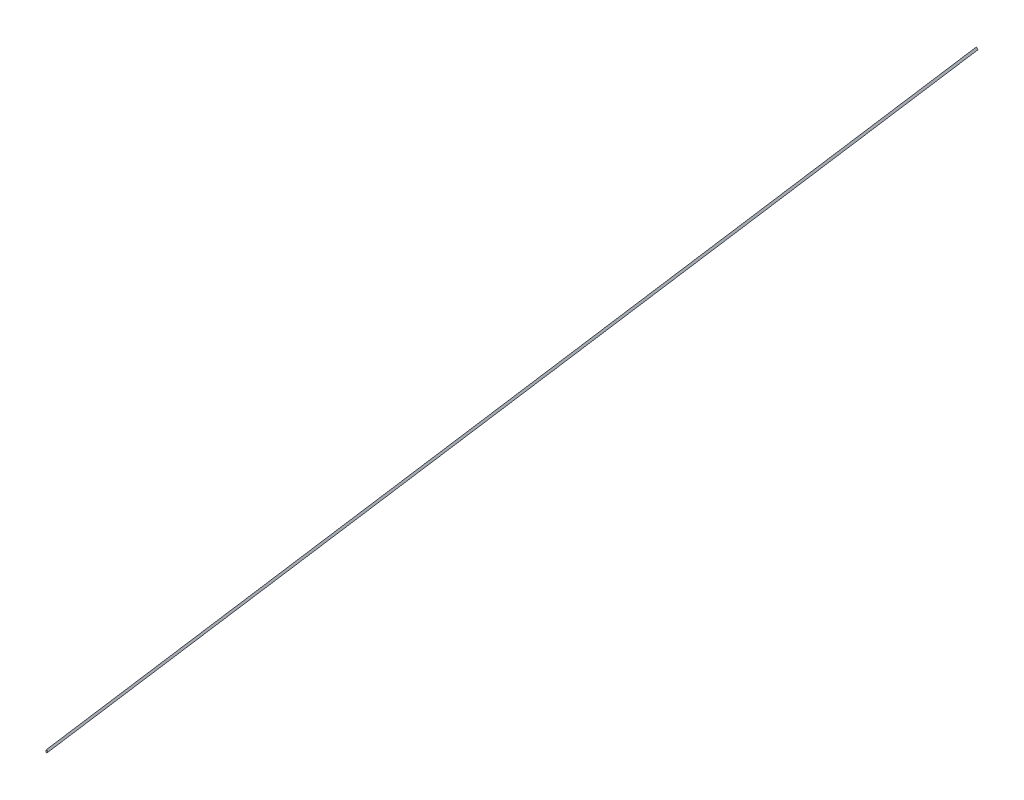
ISO-10303-21;
HEADER;
FILE_DESCRIPTION(('STEP AP214'),'2;1');
FILE_NAME('part.step','',(''),(''),'','','');
FILE_SCHEMA(('AUTOMOTIVE_DESIGN { 1 0 10303 214 1 1 1 1 }'));
ENDSEC;
DATA;
#1=APPLICATION_CONTEXT('core data for automotive mechanical design processes');
#2=APPLICATION_PROTOCOL_DEFINITION('international standard','automotive_design',2000,#1);
#3=PRODUCT_CONTEXT('',#1,'mechanical');
#4=PRODUCT('Part','Part','',(#3));
#5=PRODUCT_RELATED_PRODUCT_CATEGORY('part','',(#4));
#6=PRODUCT_DEFINITION_FORMATION('','',#4);
#7=PRODUCT_DEFINITION_CONTEXT('part definition',#1,'design');
#8=PRODUCT_DEFINITION('design','',#6,#7);
#9=PRODUCT_DEFINITION_SHAPE('','',#8);
#10=(LENGTH_UNIT() NAMED_UNIT(*) SI_UNIT(.MILLI.,.METRE.));
#11=(NAMED_UNIT(*) PLANE_ANGLE_UNIT() SI_UNIT($,.RADIAN.));
#12=(NAMED_UNIT(*) SI_UNIT($,.STERADIAN.) SOLID_ANGLE_UNIT());
#13=UNCERTAINTY_MEASURE_WITH_UNIT(LENGTH_MEASURE(1.E-05),#10,'distance_accuracy_value','');
#14=(GEOMETRIC_REPRESENTATION_CONTEXT(3) GLOBAL_UNCERTAINTY_ASSIGNED_CONTEXT((#13)) GLOBAL_UNIT_ASSIGNED_CONTEXT((#10,
#11,#12)) REPRESENTATION_CONTEXT('',''));
#15=CARTESIAN_POINT('',(0.,0.,0.));
#16=DIRECTION('',(0.,0.,1.));
#17=DIRECTION('',(1.,0.,0.));
#18=AXIS2_PLACEMENT_3D('',#15,#16,#17);
#19=CARTESIAN_POINT('',(186.802064901665,-0.100675386509625,519.));
#20=CARTESIAN_POINT('',(186.5,-0.11177,0.));
#21=CARTESIAN_POINT('',(184.301740117585,-0.192510409138579,519.));
#22=CARTESIAN_POINT('',(182.53151298792,-0.257529501676572,0.));
#23=CARTESIAN_POINT('',(179.301072240108,-0.376143444632647,519.));
#24=CARTESIAN_POINT('',(174.594503856324,-0.548989357900017,0.));
#25=CARTESIAN_POINT('',(171.800088292102,-0.651624025813091,519.));
#26=CARTESIAN_POINT('',(162.689024650844,-0.986230815817351,0.));
#27=CARTESIAN_POINT('',(165.549261937133,-0.881184244897397,519.));
#28=CARTESIAN_POINT('',(152.767778668737,-1.35058377492838,0.));
#29=CARTESIAN_POINT('',(160.548602838584,-1.06483287090551,519.));
#30=CARTESIAN_POINT('',(144.830788269321,-1.64207297234325,0.));
#31=CARTESIAN_POINT('',(156.798108613746,-1.20256980412283,519.));
#32=CARTESIAN_POINT('',(138.878042196265,-1.86068243756924,0.));
#33=CARTESIAN_POINT('',(153.047613594342,-1.34030743939232,519.));
#34=CARTESIAN_POINT('',(132.925298423687,-2.07930151934531,0.));
#35=CARTESIAN_POINT('',(149.297120243623,-1.47806767244789,519.));
#36=CARTESIAN_POINT('',(126.972554738908,-2.29795353188565,0.));
#37=CARTESIAN_POINT('',(145.546626468958,-1.61583165041204,519.000000000001));
#38=CARTESIAN_POINT('',(121.019811855344,-2.51661009477864,0.));
#39=CARTESIAN_POINT('',(141.796131966217,-1.75356762052203,518.999999999999));
#40=CARTESIAN_POINT('',(115.067066999967,-2.73522195192067,0.));
#41=CARTESIAN_POINT('',(138.045633758524,-1.8912067025621,519.));
#42=CARTESIAN_POINT('',(109.114316750361,-2.95368248147338,0.));
#43=CARTESIAN_POINT('',(134.295135189945,-2.02883378700018,518.999999999999));
#44=CARTESIAN_POINT('',(103.161565658307,-3.17212237211382,0.));
#45=CARTESIAN_POINT('',(130.544639436538,-2.16653880323468,519.000000000001));
#46=CARTESIAN_POINT('',(97.2088191359645,-3.39068553638432,0.));
#47=CARTESIAN_POINT('',(126.79415601755,-2.30457880951668,518.999999999999));
#48=CARTESIAN_POINT('',(91.2560922307617,-3.60978326754915,0.));
#49=CARTESIAN_POINT('',(123.04367951181,-2.44280650204524,519.000000000001));
#50=CARTESIAN_POINT('',(85.3033762986066,-3.82917795547762,0.));
#51=CARTESIAN_POINT('',(119.293190628649,-2.58069858507147,518.999999999999));
#52=CARTESIAN_POINT('',(79.3506405187281,-4.04803497414307,0.));
#53=CARTESIAN_POINT('',(115.542663981789,-2.71756041207499,519.000000000001));
#54=CARTESIAN_POINT('',(73.3978449968089,-4.26526177279992,0.));
#55=CARTESIAN_POINT('',(111.792099133404,-2.85337023846857,518.999999999999));
#56=CARTESIAN_POINT('',(67.4449888186704,-4.48081854067511,0.));
#57=CARTESIAN_POINT('',(108.041576692501,-2.99034981164939,519.000000000001));
#58=CARTESIAN_POINT('',(61.4922000664194,-4.69823450098391,0.));
#59=CARTESIAN_POINT('',(104.916240295201,-3.10718781737445,518.999999999999));
#60=CARTESIAN_POINT('',(56.5316998345521,-4.88368190800431,0.));
#61=CARTESIAN_POINT('',(102.416059258898,-3.20297729290566,519.000000000001));
#62=CARTESIAN_POINT('',(52.5634391978605,-5.03571228957255,0.));
#63=CARTESIAN_POINT('',(100.540884166601,-3.27378942976373,518.999999999999));
#64=CARTESIAN_POINT('',(49.5871813378727,-5.14810293094317,0.));
#65=CARTESIAN_POINT('',(98.6656108674653,-3.3419653106147,519.000000000001));
#66=CARTESIAN_POINT('',(46.6107678740035,-5.25631220502355,0.));
#67=CARTESIAN_POINT('',(96.7901760209638,-3.40558730248682,518.999999999999));
#68=CARTESIAN_POINT('',(43.6340974638197,-5.3572893525467,0.));
#69=CARTESIAN_POINT('',(94.9145376313825,-3.46291901247415,519.000000000001));
#70=CARTESIAN_POINT('',(40.657104862593,-5.44828777412586,0.));
#71=CARTESIAN_POINT('',(93.038665939881,-3.51215358959958,518.999999999999));
#72=CARTESIAN_POINT('',(37.6797406382333,-5.52642852700462,0.));
#73=CARTESIAN_POINT('',(91.1625597569897,-3.55145985718924,519.000000000001));
#74=CARTESIAN_POINT('',(34.7020064745827,-5.58882176611169,0.));
#75=CARTESIAN_POINT('',(89.2862279836366,-3.57850640902768,519.));
#76=CARTESIAN_POINT('',(31.7239103324324,-5.63173511470213,0.));
#77=CARTESIAN_POINT('',(87.409741864013,-3.5904998636462,519.));
#78=CARTESIAN_POINT('',(28.7455763805329,-5.65079740180175,0.));
#79=CARTESIAN_POINT('',(85.5332077088808,-3.58548939833163,519.));
#80=CARTESIAN_POINT('',(25.7671528977219,-5.64279356511219,0.));
#81=CARTESIAN_POINT('',(83.6568497219253,-3.55964975904292,519.));
#82=CARTESIAN_POINT('',(22.7890338216423,-5.60187601806448,0.));
#83=CARTESIAN_POINT('',(81.7808786673004,-3.5130585014027,518.999999999999));
#84=CARTESIAN_POINT('',(19.8114826383477,-5.52774021029471,0.));
#85=CARTESIAN_POINT('',(79.9058234901467,-3.43716828258325,519.000000000001));
#86=CARTESIAN_POINT('',(16.8354711329934,-5.40769680488722,0.));
#87=CARTESIAN_POINT('',(78.3441072462963,-3.35848244867081,519.));
#88=CARTESIAN_POINT('',(14.3566626418469,-5.28138624741325,0.));
#89=CARTESIAN_POINT('',(77.0953844812278,-3.2807056217589,519.));
#90=CARTESIAN_POINT('',(12.3747641743416,-5.16002593665186,0.));
#91=CARTESIAN_POINT('',(76.160202158715,-3.20513228627803,519.));
#92=CARTESIAN_POINT('',(10.8904521706146,-5.03799108853755,0.));
#93=CARTESIAN_POINT('',(75.2274142237736,-3.10249160009424,519.));
#94=CARTESIAN_POINT('',(9.40978440042407,-4.87751220635519,0.));
#95=CARTESIAN_POINT('',(74.4532837150413,-2.99154697838824,519.));
#96=CARTESIAN_POINT('',(8.18147453470778,-4.69868922644025,0.));
#97=CARTESIAN_POINT('',(73.8372821062703,-2.8831255687215,519.));
#98=CARTESIAN_POINT('',(7.20323395712825,-4.52931245745169,0.));
#99=CARTESIAN_POINT('',(73.3763082790299,-2.79586453624127,519.));
#100=CARTESIAN_POINT('',(6.47160946854494,-4.39073325062386,0.));
#101=CARTESIAN_POINT('',(72.915737811358,-2.70654640945164,519.));
#102=CARTESIAN_POINT('',(5.74141475253422,-4.2450575245412,0.));
#103=CARTESIAN_POINT('',(72.3029059406366,-2.58112977877818,519.));
#104=CARTESIAN_POINT('',(4.76768811347214,-4.05164297404024,0.));
#105=CARTESIAN_POINT('',(71.5405905264677,-2.40577999513244,519.000000000001));
#106=CARTESIAN_POINT('',(3.55842294034228,-3.76841814399723,0.));
#107=CARTESIAN_POINT('',(70.8119676778371,-2.10792941007383,519.));
#108=CARTESIAN_POINT('',(2.40186473926827,-3.2984816700545,0.));
#109=CARTESIAN_POINT('',(70.2901823562888,-1.76022395892359,519.));
#110=CARTESIAN_POINT('',(1.57347980977523,-2.74552357927177,0.));
#111=CARTESIAN_POINT('',(69.9322848060866,-1.45563144790039,519.));
#112=CARTESIAN_POINT('',(1.00583730005579,-2.26221820231581,0.));
#113=CARTESIAN_POINT('',(69.6209928808814,-1.10268141185139,518.999999999999));
#114=CARTESIAN_POINT('',(0.51082840001471,-1.70278747624527,0.));
#115=CARTESIAN_POINT('',(69.4182806796947,-0.765811531804186,519.));
#116=CARTESIAN_POINT('',(0.190864812022949,-1.16640121149693,0.));
#117=CARTESIAN_POINT('',(69.3195122235756,-0.46691093406255,519.));
#118=CARTESIAN_POINT('',(0.0311253443158539,-0.694219177651205,0.));
#119=CARTESIAN_POINT('',(69.2846368052604,-0.234276118684475,519.));
#120=CARTESIAN_POINT('',(-0.0196762472607387,-0.323590964991827,0.));
#121=CARTESIAN_POINT('',(69.2964625820786,0.000575083985347309,519.));
#122=CARTESIAN_POINT('',(-0.00586108749585029,0.0497314369156607,0.));
#123=CARTESIAN_POINT('',(69.3642763023404,0.307974794839633,519.000000000001));
#124=CARTESIAN_POINT('',(0.105851916702266,0.535756685004302,0.));
#125=CARTESIAN_POINT('',(69.5274630317256,0.665176367532593,519.));
#126=CARTESIAN_POINT('',(0.361870478347706,1.1044539142411,0.));
#127=CARTESIAN_POINT('',(69.7870188963323,1.05705953616754,519.));
#128=CARTESIAN_POINT('',(0.775569706156999,1.72537269203636,0.));
#129=CARTESIAN_POINT('',(70.0850236431449,1.41987487798281,519.));
#130=CARTESIAN_POINT('',(1.24771265738761,2.30176696607214,0.));
#131=CARTESIAN_POINT('',(70.4046355829996,1.76341825838555,518.999999999999));
#132=CARTESIAN_POINT('',(1.75542493778853,2.84677028488833,0.));
#133=CARTESIAN_POINT('',(70.7354697947136,2.09607309107059,519.000000000001));
#134=CARTESIAN_POINT('',(2.28031660971245,3.37488409530116,0.));
#135=CARTESIAN_POINT('',(71.0703055353229,2.4246630454258,518.999999999999));
#136=CARTESIAN_POINT('',(2.81185180112898,3.89636969195818,0.));
#137=CARTESIAN_POINT('',(71.4126480005322,2.74548767898256,519.000000000001));
#138=CARTESIAN_POINT('',(3.35518193565325,4.40558982567713,0.));
#139=CARTESIAN_POINT('',(71.7654339071712,3.05485231926029,518.999999999999));
#140=CARTESIAN_POINT('',(3.91512565220644,4.8966189743816,0.));
#141=CARTESIAN_POINT('',(72.1302900995024,3.34987392654191,519.000000000001));
#142=CARTESIAN_POINT('',(4.49422431810771,5.36486034141795,0.));
#143=CARTESIAN_POINT('',(72.6308634247749,3.72515334058811,518.999999999999));
#144=CARTESIAN_POINT('',(5.28872386006556,5.96051570277589,0.));
#145=CARTESIAN_POINT('',(73.2822399015257,4.15852285642544,519.));
#146=CARTESIAN_POINT('',(6.3225810318319,6.64835006754605,0.));
#147=CARTESIAN_POINT('',(74.0946092419458,4.62864442571416,519.000000000001));
#148=CARTESIAN_POINT('',(7.61196309147069,7.39452813032449,0.));
#149=CARTESIAN_POINT('',(74.9279589470546,5.06020903963744,519.));
#150=CARTESIAN_POINT('',(8.93464571141178,8.07950371220677,0.));
#151=CARTESIAN_POINT('',(75.7783590794079,5.45704542115885,519.000000000001));
#152=CARTESIAN_POINT('',(10.284391030357,8.70935979985582,0.));
#153=CARTESIAN_POINT('',(76.6414680286125,5.82520676973568,518.999999999999));
#154=CARTESIAN_POINT('',(11.6543074041472,9.29370410949651,0.));
#155=CARTESIAN_POINT('',(77.5141207691668,6.17009462478968,519.));
#156=CARTESIAN_POINT('',(13.0393725121408,9.84110469365126,0.));
#157=CARTESIAN_POINT('',(78.3943674269924,6.49501002295762,519.));
#158=CARTESIAN_POINT('',(14.4364892051698,10.3568136649554,0.));
#159=CARTESIAN_POINT('',(79.2800921307167,6.80464963745708,519.));
#160=CARTESIAN_POINT('',(15.8423035573358,10.848259863891,0.));
#161=CARTESIAN_POINT('',(80.1706874884467,7.09997632518966,519.));
#162=CARTESIAN_POINT('',(17.2558428445566,11.3170228262168,0.));
#163=CARTESIAN_POINT('',(81.0661551022846,7.3802223835755,519.));
#164=CARTESIAN_POINT('',(18.677125158932,11.7617918938286,0.));
#165=CARTESIAN_POINT('',(81.9662508152407,7.64517735256458,519.));
#166=CARTESIAN_POINT('',(20.1057405616819,12.1823630123569,0.));
#167=CARTESIAN_POINT('',(83.1719072713148,7.97913494696539,519.));
#168=CARTESIAN_POINT('',(22.0193521287151,12.7123865346097,0.));
#169=CARTESIAN_POINT('',(84.6881407391087,8.36237579751592,519.000000000001));
#170=CARTESIAN_POINT('',(24.4258925728851,13.3206790852296,0.));
#171=CARTESIAN_POINT('',(86.5191116425936,8.77393209885549,518.999999999999));
#172=CARTESIAN_POINT('',(27.3319908337744,13.9739287373055,0.));
#173=CARTESIAN_POINT('',(88.3594288690151,9.14140941317154,519.000000000001));
#174=CARTESIAN_POINT('',(30.2529321337696,14.557074638031,0.));
#175=CARTESIAN_POINT('',(90.2080291006012,9.46463506703223,519.));
#176=CARTESIAN_POINT('',(33.1869862385385,15.0703296729119,0.));
#177=CARTESIAN_POINT('',(92.0640523386663,9.74222880420643,519.));
#178=CARTESIAN_POINT('',(36.1328928461894,15.5104879956208,0.));
#179=CARTESIAN_POINT('',(93.9266280813164,9.97179066584406,519.));
#180=CARTESIAN_POINT('',(39.0890758637837,15.8755604444459,0.));
#181=CARTESIAN_POINT('',(95.7939159369522,10.1583801684968,519.));
#182=CARTESIAN_POINT('',(42.0529144334272,16.1708309628102,0.));
#183=CARTESIAN_POINT('',(98.2882077886442,10.3571757102286,518.999999999999));
#184=CARTESIAN_POINT('',(46.0117213359558,16.4870725242194,0.));
#185=CARTESIAN_POINT('',(101.411447486462,10.5256368030861,519.000000000001));
#186=CARTESIAN_POINT('',(50.9689623977678,16.7541688613502,0.));
#187=CARTESIAN_POINT('',(105.162522333063,10.6499152365233,518.999999999999));
#188=CARTESIAN_POINT('',(56.9225854931495,16.9515307073642,0.));
#189=CARTESIAN_POINT('',(108.914787161886,10.7286428942635,519.000000000001));
#190=CARTESIAN_POINT('',(62.878167059554,17.0763439398652,0.));
#191=CARTESIAN_POINT('',(112.667939144647,10.7454891679668,518.999999999999));
#192=CARTESIAN_POINT('',(68.8351144762445,17.1031705173644,0.));
#193=CARTESIAN_POINT('',(116.420770467995,10.692913200216,519.000000000001));
#194=CARTESIAN_POINT('',(74.7915759799195,17.0196743995973,0.));
#195=CARTESIAN_POINT('',(120.171702143721,10.5615575011206,518.999999999999));
#196=CARTESIAN_POINT('',(80.7450104761488,16.8112163894735,0.));
#197=CARTESIAN_POINT('',(123.919518758997,10.3615353255813,519.));
#198=CARTESIAN_POINT('',(86.6935062774885,16.4937267510464,0.));
#199=CARTESIAN_POINT('',(127.663513688025,10.0996772562087,519.));
#200=CARTESIAN_POINT('',(92.6359350902858,16.078122539833,0.));
#201=CARTESIAN_POINT('',(131.403356338123,9.78436237576417,519.));
#202=CARTESIAN_POINT('',(98.5717709598855,15.5776430192207,0.));
#203=CARTESIAN_POINT('',(135.138327593319,9.41572798250734,519.));
#204=CARTESIAN_POINT('',(104.499882257419,14.992574630128,0.));
#205=CARTESIAN_POINT('',(138.867757224693,8.99469781464294,519.));
#206=CARTESIAN_POINT('',(110.419182996881,14.324278725264,0.));
#207=CARTESIAN_POINT('',(142.590867676924,8.52115735485082,519.));
#208=CARTESIAN_POINT('',(116.328482783678,13.5727576636436,0.));
#209=CARTESIAN_POINT('',(146.307668007778,8.00042382423986,518.999999999999));
#210=CARTESIAN_POINT('',(122.22771209017,12.7461060378356,0.));
#211=CARTESIAN_POINT('',(150.018269038257,7.43750358717203,519.000000000001));
#212=CARTESIAN_POINT('',(128.117209234075,11.8529453870467,0.));
#213=CARTESIAN_POINT('',(153.723370970154,6.83926062043783,519.));
#214=CARTESIAN_POINT('',(133.997778866043,10.9028846596537,0.));
#215=CARTESIAN_POINT('',(157.422696781995,6.20664729050174,519.));
#216=CARTESIAN_POINT('',(139.869499775633,9.89959500056334,0.));
#217=CARTESIAN_POINT('',(161.116362652529,5.5414619469668,519.));
#218=CARTESIAN_POINT('',(145.731896750819,8.84320344169156,0.));
#219=CARTESIAN_POINT('',(166.03322719479,4.61111894343827,519.));
#220=CARTESIAN_POINT('',(153.535721304373,7.36589874472885,0.));
#221=CARTESIAN_POINT('',(170.937341764311,3.61563233066163,519.));
#222=CARTESIAN_POINT('',(161.32013042915,5.78854065201773,0.));
#223=CARTESIAN_POINT('',(175.830483068152,2.56760701646496,519.));
#224=CARTESIAN_POINT('',(169.085620297792,4.12162508901313,0.));
#225=CARTESIAN_POINT('',(179.493928807153,1.75239650534458,519.));
#226=CARTESIAN_POINT('',(174.900524341098,2.82912948503774,0.));
#227=CARTESIAN_POINT('',(183.150040701236,0.905072293988474,519.));
#228=CARTESIAN_POINT('',(180.704029066626,1.48645900579351,0.));
#229=CARTESIAN_POINT('',(185.58479942704,0.328720348079635,519.));
#230=CARTESIAN_POINT('',(184.567970106492,0.56976201866848,0.));
#231=CARTESIAN_POINT('',(186.84509768735,0.0299638193615717,519.));
#232=CARTESIAN_POINT('',(186.568301147184,0.0955790599004437,0.));
#233=CARTESIAN_POINT('',(186.930671321919,0.00967839739544089,519.));
#234=CARTESIAN_POINT('',(186.70412264567,0.0633822691162288,0.));
#235=CARTESIAN_POINT('',(187.059277742173,-0.0208080429147428,519.000000000001));
#236=CARTESIAN_POINT('',(186.908245291341,0.0149945382324509,0.));
#237=CARTESIAN_POINT('',(187.187884162427,-0.0512944832249222,519.));
#238=CARTESIAN_POINT('',(187.112367937011,-0.0333931926513245,0.));
#239=CARTESIAN_POINT('',(187.27362177593,-0.0716187767650499,519.));
#240=CARTESIAN_POINT('',(187.248449700791,-0.0656516799071842,0.));
#241=CARTESIAN_POINT('',(187.316490582681,-0.0817809235351109,519.));
#242=CARTESIAN_POINT('',(187.316490582681,-0.0817809235351109,0.));
#243=B_SPLINE_SURFACE_WITH_KNOTS('',3,1,((#19,#20),(#21,#22),(#23,#24),(#25,#26),(#27,#28),(#29,
#30),(#31,#32),(#33,#34),(#35,#36),(#37,#38),(#39,#40),(#41,#42),(#43,#44),(#45,#46),(#47,#48),
(#49,#50),(#51,#52),(#53,#54),(#55,#56),(#57,#58),(#59,#60),(#61,#62),(#63,#64),(#65,#66),(#67,
#68),(#69,#70),(#71,#72),(#73,#74),(#75,#76),(#77,#78),(#79,#80),(#81,#82),(#83,#84),(#85,#86),
(#87,#88),(#89,#90),(#91,#92),(#93,#94),(#95,#96),(#97,#98),(#99,#100),(#101,#102),(#103,#104),
(#105,#106),(#107,#108),(#109,#110),(#111,#112),(#113,#114),(#115,#116),(#117,#118),(#119,#120),
(#121,#122),(#123,#124),(#125,#126),(#127,#128),(#129,#130),(#131,#132),(#133,#134),(#135,#136),
(#137,#138),(#139,#140),(#141,#142),(#143,#144),(#145,#146),(#147,#148),(#149,#150),(#151,#152),
(#153,#154),(#155,#156),(#157,#158),(#159,#160),(#161,#162),(#163,#164),(#165,#166),(#167,#168),
(#169,#170),(#171,#172),(#173,#174),(#175,#176),(#177,#178),(#179,#180),(#181,#182),(#183,#184),
(#185,#186),(#187,#188),(#189,#190),(#191,#192),(#193,#194),(#195,#196),(#197,#198),(#199,#200),
(#201,#202),(#203,#204),(#205,#206),(#207,#208),(#209,#210),(#211,#212),(#213,#214),(#215,#216),
(#217,#218),(#219,#220),(#221,#222),(#223,#224),(#225,#226),(#227,#228),(#229,#230),(#231,#232),
(#233,#234),(#235,#236),(#237,#238),(#239,#240),(#241,#242)),.UNSPECIFIED.,.F.,.F.,.F.,(4,1,1,1,
1,1,1,1,1,1,1,1,1,1,1,1,1,1,1,1,1,1,1,1,1,1,1,1,1,1,1,1,1,1,1,1,1,1,1,1,1,1,1,1,1,1,1,1,1,1,1,1,
1,1,1,1,1,1,1,1,1,1,1,1,1,1,1,1,1,1,1,1,1,1,1,1,1,1,1,1,1,1,1,1,1,1,1,1,1,1,1,1,1,1,1,1,1,1,1,1,
1,1,1,1,2,1,1,1,4),(2,2),(0.,0.0311811053211745,0.0623622106423489,0.0935433159635234,
0.109133868624111,0.124724421284698,0.140314973945285,0.155905526605872,0.17149607926646,
0.187086631927047,0.202677184587634,0.218267737248221,0.233858289908809,0.249448842569396,
0.265039395229983,0.28062994789057,0.296220500551158,0.311811053211745,0.327401605872332,
0.342992158532919,0.350787434863213,0.358582711193506,0.3663779875238,0.374173263854094,
0.381968540184387,0.389763816514681,0.397559092844974,0.405354369175268,0.413149645505562,
0.420944921835855,0.428740198166149,0.436535474496443,0.444330750826736,0.45212602715703,
0.456023665322177,0.459921303487323,0.46381894165247,0.467716579817617,0.46966539890019,
0.471614217982764,0.473563037065337,0.475511856147911,0.479409494313058,0.483307132478204,
0.485255951560778,0.487204770643351,0.489153589725925,0.491102408808498,0.492076818349785,
0.493051227891071,0.494025637432358,0.495000046973645,0.496948866056218,0.498897685138791,
0.500846504221365,0.502795323303939,0.504744142386512,0.506692961469085,0.508641780551659,
0.510590599634232,0.512539418716806,0.514488237799379,0.518385875964525,0.522283514129673,
0.526181152294819,0.530078790459966,0.533976428625113,0.53787406679026,0.541771704955407,
0.545669343120553,0.5495669812857,0.553464619450847,0.557362257615994,0.561259895781141,
0.569055172111434,0.576850448441728,0.584645724772021,0.592441001102315,0.600236277432609,
0.608031553762902,0.615826830093196,0.62362210642349,0.639212659084077,0.654803211744664,
0.670393764405251,0.685984317065839,0.701574869726425,0.717165422387013,0.7327559750476,
0.748346527708187,0.763937080368774,0.779527633029362,0.795118185689949,0.810708738350536,
0.826299291011123,0.841889843671711,0.857480396332298,0.873070948992885,0.888661501653472,
0.90425205431406,0.935433159635234,0.951023712295821,0.966614264956409,0.982204817616996,
0.997795370277583,0.998346527708187,0.998897685138791,0.999448842569396,1.),(0.,1.),.UNSPECIFIED.);
#244=CARTESIAN_POINT('',(186.802064901665,-0.100675386509625,519.));
#245=CARTESIAN_POINT('',(184.301740117585,-0.192510409138579,519.));
#246=CARTESIAN_POINT('',(179.301072240108,-0.376143444632647,519.));
#247=CARTESIAN_POINT('',(171.800088292102,-0.651624025813091,519.));
#248=CARTESIAN_POINT('',(165.549261937133,-0.881184244897397,519.));
#249=CARTESIAN_POINT('',(160.548602838584,-1.06483287090551,519.));
#250=CARTESIAN_POINT('',(156.798108613746,-1.20256980412283,519.));
#251=CARTESIAN_POINT('',(153.047613594342,-1.34030743939232,519.));
#252=CARTESIAN_POINT('',(149.297120243623,-1.47806767244789,519.));
#253=CARTESIAN_POINT('',(145.546626468958,-1.61583165041204,519.000000000001));
#254=CARTESIAN_POINT('',(141.796131966217,-1.75356762052203,518.999999999999));
#255=CARTESIAN_POINT('',(138.045633758524,-1.8912067025621,519.));
#256=CARTESIAN_POINT('',(134.295135189945,-2.02883378700018,518.999999999999));
#257=CARTESIAN_POINT('',(130.544639436538,-2.16653880323468,519.000000000001));
#258=CARTESIAN_POINT('',(126.79415601755,-2.30457880951668,518.999999999999));
#259=CARTESIAN_POINT('',(123.04367951181,-2.44280650204524,519.000000000001));
#260=CARTESIAN_POINT('',(119.293190628649,-2.58069858507147,518.999999999999));
#261=CARTESIAN_POINT('',(115.542663981789,-2.71756041207499,519.000000000001));
#262=CARTESIAN_POINT('',(111.792099133404,-2.85337023846857,518.999999999999));
#263=CARTESIAN_POINT('',(108.041576692501,-2.99034981164939,519.000000000001));
#264=CARTESIAN_POINT('',(104.916240295201,-3.10718781737445,518.999999999999));
#265=CARTESIAN_POINT('',(102.416059258898,-3.20297729290566,519.000000000001));
#266=CARTESIAN_POINT('',(100.540884166601,-3.27378942976373,518.999999999999));
#267=CARTESIAN_POINT('',(98.6656108674653,-3.3419653106147,519.000000000001));
#268=CARTESIAN_POINT('',(96.7901760209638,-3.40558730248682,518.999999999999));
#269=CARTESIAN_POINT('',(94.9145376313825,-3.46291901247415,519.000000000001));
#270=CARTESIAN_POINT('',(93.038665939881,-3.51215358959958,518.999999999999));
#271=CARTESIAN_POINT('',(91.1625597569897,-3.55145985718924,519.000000000001));
#272=CARTESIAN_POINT('',(89.2862279836366,-3.57850640902768,519.));
#273=CARTESIAN_POINT('',(87.409741864013,-3.5904998636462,519.));
#274=CARTESIAN_POINT('',(85.5332077088808,-3.58548939833163,519.));
#275=CARTESIAN_POINT('',(83.6568497219253,-3.55964975904292,519.));
#276=CARTESIAN_POINT('',(81.7808786673004,-3.5130585014027,518.999999999999));
#277=CARTESIAN_POINT('',(79.9058234901467,-3.43716828258325,519.000000000001));
#278=CARTESIAN_POINT('',(78.3441072462963,-3.35848244867081,519.));
#279=CARTESIAN_POINT('',(77.0953844812278,-3.2807056217589,519.));
#280=CARTESIAN_POINT('',(76.160202158715,-3.20513228627803,519.));
#281=CARTESIAN_POINT('',(75.2274142237736,-3.10249160009424,519.));
#282=CARTESIAN_POINT('',(74.4532837150413,-2.99154697838824,519.));
#283=CARTESIAN_POINT('',(73.8372821062703,-2.8831255687215,519.));
#284=CARTESIAN_POINT('',(73.3763082790299,-2.79586453624127,519.));
#285=CARTESIAN_POINT('',(72.915737811358,-2.70654640945164,519.));
#286=CARTESIAN_POINT('',(72.3029059406366,-2.58112977877818,519.));
#287=CARTESIAN_POINT('',(71.5405905264677,-2.40577999513244,519.000000000001));
#288=CARTESIAN_POINT('',(70.8119676778371,-2.10792941007383,519.));
#289=CARTESIAN_POINT('',(70.2901823562888,-1.76022395892359,519.));
#290=CARTESIAN_POINT('',(69.9322848060866,-1.45563144790039,519.));
#291=CARTESIAN_POINT('',(69.6209928808814,-1.10268141185139,518.999999999999));
#292=CARTESIAN_POINT('',(69.4182806796947,-0.765811531804186,519.));
#293=CARTESIAN_POINT('',(69.3195122235756,-0.46691093406255,519.));
#294=CARTESIAN_POINT('',(69.2846368052604,-0.234276118684475,519.));
#295=CARTESIAN_POINT('',(69.2964625820786,0.000575083985347309,519.));
#296=CARTESIAN_POINT('',(69.3642763023404,0.307974794839633,519.000000000001));
#297=CARTESIAN_POINT('',(69.5274630317256,0.665176367532593,519.));
#298=CARTESIAN_POINT('',(69.7870188963323,1.05705953616754,519.));
#299=CARTESIAN_POINT('',(70.0850236431449,1.41987487798281,519.));
#300=CARTESIAN_POINT('',(70.4046355829996,1.76341825838555,518.999999999999));
#301=CARTESIAN_POINT('',(70.7354697947136,2.09607309107059,519.000000000001));
#302=CARTESIAN_POINT('',(71.0703055353229,2.4246630454258,518.999999999999));
#303=CARTESIAN_POINT('',(71.4126480005322,2.74548767898256,519.000000000001));
#304=CARTESIAN_POINT('',(71.7654339071712,3.05485231926029,518.999999999999));
#305=CARTESIAN_POINT('',(72.1302900995024,3.34987392654191,519.000000000001));
#306=CARTESIAN_POINT('',(72.6308634247749,3.72515334058811,518.999999999999));
#307=CARTESIAN_POINT('',(73.2822399015257,4.15852285642544,519.));
#308=CARTESIAN_POINT('',(74.0946092419458,4.62864442571416,519.000000000001));
#309=CARTESIAN_POINT('',(74.9279589470546,5.06020903963744,519.));
#310=CARTESIAN_POINT('',(75.7783590794079,5.45704542115885,519.000000000001));
#311=CARTESIAN_POINT('',(76.6414680286125,5.82520676973568,518.999999999999));
#312=CARTESIAN_POINT('',(77.5141207691668,6.17009462478968,519.));
#313=CARTESIAN_POINT('',(78.3943674269924,6.49501002295762,519.));
#314=CARTESIAN_POINT('',(79.2800921307167,6.80464963745708,519.));
#315=CARTESIAN_POINT('',(80.1706874884467,7.09997632518966,519.));
#316=CARTESIAN_POINT('',(81.0661551022846,7.3802223835755,519.));
#317=CARTESIAN_POINT('',(81.9662508152407,7.64517735256458,519.));
#318=CARTESIAN_POINT('',(83.1719072713148,7.97913494696539,519.));
#319=CARTESIAN_POINT('',(84.6881407391087,8.36237579751592,519.000000000001));
#320=CARTESIAN_POINT('',(86.5191116425936,8.77393209885549,518.999999999999));
#321=CARTESIAN_POINT('',(88.3594288690151,9.14140941317154,519.000000000001));
#322=CARTESIAN_POINT('',(90.2080291006012,9.46463506703223,519.));
#323=CARTESIAN_POINT('',(92.0640523386663,9.74222880420643,519.));
#324=CARTESIAN_POINT('',(93.9266280813164,9.97179066584406,519.));
#325=CARTESIAN_POINT('',(95.7939159369522,10.1583801684968,519.));
#326=CARTESIAN_POINT('',(98.2882077886442,10.3571757102286,518.999999999999));
#327=CARTESIAN_POINT('',(101.411447486462,10.5256368030861,519.000000000001));
#328=CARTESIAN_POINT('',(105.162522333063,10.6499152365233,518.999999999999));
#329=CARTESIAN_POINT('',(108.914787161886,10.7286428942635,519.000000000001));
#330=CARTESIAN_POINT('',(112.667939144647,10.7454891679668,518.999999999999));
#331=CARTESIAN_POINT('',(116.420770467995,10.692913200216,519.000000000001));
#332=CARTESIAN_POINT('',(120.171702143721,10.5615575011206,518.999999999999));
#333=CARTESIAN_POINT('',(123.919518758997,10.3615353255813,519.));
#334=CARTESIAN_POINT('',(127.663513688025,10.0996772562087,519.));
#335=CARTESIAN_POINT('',(131.403356338123,9.78436237576417,519.));
#336=CARTESIAN_POINT('',(135.138327593319,9.41572798250734,519.));
#337=CARTESIAN_POINT('',(138.867757224693,8.99469781464294,519.));
#338=CARTESIAN_POINT('',(142.590867676924,8.52115735485082,519.));
#339=CARTESIAN_POINT('',(146.307668007778,8.00042382423986,518.999999999999));
#340=CARTESIAN_POINT('',(150.018269038257,7.43750358717203,519.000000000001));
#341=CARTESIAN_POINT('',(153.723370970154,6.83926062043783,519.));
#342=CARTESIAN_POINT('',(157.422696781995,6.20664729050174,519.));
#343=CARTESIAN_POINT('',(161.116362652529,5.5414619469668,519.));
#344=CARTESIAN_POINT('',(166.03322719479,4.61111894343827,519.));
#345=CARTESIAN_POINT('',(170.937341764311,3.61563233066163,519.));
#346=CARTESIAN_POINT('',(175.830483068152,2.56760701646496,519.));
#347=CARTESIAN_POINT('',(179.493928807153,1.75239650534458,519.));
#348=CARTESIAN_POINT('',(183.150040701236,0.905072293988474,519.));
#349=CARTESIAN_POINT('',(185.58479942704,0.328720348079635,519.));
#350=CARTESIAN_POINT('',(186.84509768735,0.0299638193615717,519.));
#351=CARTESIAN_POINT('',(186.930671321919,0.00967839739544089,519.));
#352=CARTESIAN_POINT('',(187.059277742173,-0.0208080429147428,519.000000000001));
#353=CARTESIAN_POINT('',(187.187884162427,-0.0512944832249222,519.));
#354=CARTESIAN_POINT('',(187.27362177593,-0.0716187767650499,519.));
#355=CARTESIAN_POINT('',(187.316490582681,-0.0817809235351109,519.));
#356=B_SPLINE_CURVE_WITH_KNOTS('',3,(#244,#245,#246,#247,#248,#249,#250,#251,#252,#253,#254,
#255,#256,#257,#258,#259,#260,#261,#262,#263,#264,#265,#266,#267,#268,#269,#270,#271,#272,#273,
#274,#275,#276,#277,#278,#279,#280,#281,#282,#283,#284,#285,#286,#287,#288,#289,#290,#291,#292,
#293,#294,#295,#296,#297,#298,#299,#300,#301,#302,#303,#304,#305,#306,#307,#308,#309,#310,#311,
#312,#313,#314,#315,#316,#317,#318,#319,#320,#321,#322,#323,#324,#325,#326,#327,#328,#329,#330,
#331,#332,#333,#334,#335,#336,#337,#338,#339,#340,#341,#342,#343,#344,#345,#346,#347,#348,#349,
#350,#351,#352,#353,#354,#355),.UNSPECIFIED.,.F.,.F.,(4,1,1,1,1,1,1,1,1,1,1,1,1,1,1,1,1,1,1,1,1,
1,1,1,1,1,1,1,1,1,1,1,1,1,1,1,1,1,1,1,1,1,1,1,1,1,1,1,1,1,1,1,1,1,1,1,1,1,1,1,1,1,1,1,1,1,1,1,1,
1,1,1,1,1,1,1,1,1,1,1,1,1,1,1,1,1,1,1,1,1,1,1,1,1,1,1,1,1,1,1,1,1,1,1,2,1,1,1,4),(0.,
0.0311811053211745,0.0623622106423489,0.0935433159635234,0.109133868624111,0.124724421284698,
0.140314973945285,0.155905526605872,0.17149607926646,0.187086631927047,0.202677184587634,
0.218267737248221,0.233858289908809,0.249448842569396,0.265039395229983,0.28062994789057,
0.296220500551158,0.311811053211745,0.327401605872332,0.342992158532919,0.350787434863213,
0.358582711193506,0.3663779875238,0.374173263854094,0.381968540184387,0.389763816514681,
0.397559092844974,0.405354369175268,0.413149645505562,0.420944921835855,0.428740198166149,
0.436535474496443,0.444330750826736,0.45212602715703,0.456023665322177,0.459921303487323,
0.46381894165247,0.467716579817617,0.46966539890019,0.471614217982764,0.473563037065337,
0.475511856147911,0.479409494313058,0.483307132478204,0.485255951560778,0.487204770643351,
0.489153589725925,0.491102408808498,0.492076818349785,0.493051227891071,0.494025637432358,
0.495000046973645,0.496948866056218,0.498897685138791,0.500846504221365,0.502795323303939,
0.504744142386512,0.506692961469085,0.508641780551659,0.510590599634232,0.512539418716806,
0.514488237799379,0.518385875964525,0.522283514129673,0.526181152294819,0.530078790459966,
0.533976428625113,0.53787406679026,0.541771704955407,0.545669343120553,0.5495669812857,
0.553464619450847,0.557362257615994,0.561259895781141,0.569055172111434,0.576850448441728,
0.584645724772021,0.592441001102315,0.600236277432609,0.608031553762902,0.615826830093196,
0.62362210642349,0.639212659084077,0.654803211744664,0.670393764405251,0.685984317065839,
0.701574869726425,0.717165422387013,0.7327559750476,0.748346527708187,0.763937080368774,
0.779527633029362,0.795118185689949,0.810708738350536,0.826299291011123,0.841889843671711,
0.857480396332298,0.873070948992885,0.888661501653472,0.90425205431406,0.935433159635234,
0.951023712295821,0.966614264956409,0.982204817616996,0.997795370277583,0.998346527708187,
0.998897685138791,0.999448842569396,1.),.UNSPECIFIED.);
#357=CARTESIAN_POINT('',(69.4670751072604,-0.832923282789486,519.));
#358=VERTEX_POINT('',#357);
#359=CARTESIAN_POINT('',(69.5754874767769,0.724512523223147,519.));
#360=VERTEX_POINT('',#359);
#361=EDGE_CURVE('E85',#358,#360,#356,.T.);
#362=CARTESIAN_POINT('',(69.5754839111667,0.724516088000441,518.999999999945));
#363=CARTESIAN_POINT('',(69.4624716298262,0.724633940232413,518.154513580061));
#364=CARTESIAN_POINT('',(69.3494595447832,0.724751592560027,517.309027133911));
#365=CARTESIAN_POINT('',(68.7844000960259,0.725338859908244,513.0815947725));
#366=CARTESIAN_POINT('',(68.3323556616841,0.72580549205928,509.699648465271));
#367=CARTESIAN_POINT('',(66.7271122655217,0.727451487925129,497.690022920928));
#368=CARTESIAN_POINT('',(65.5739301599798,0.728613695227727,489.062341428392));
#369=CARTESIAN_POINT('',(62.114440469441,0.732042678754324,463.179289374367));
#370=CARTESIAN_POINT('',(59.8081895105607,0.734251816597096,445.923911236684));
#371=CARTESIAN_POINT('',(52.8896412678518,0.740670941162551,394.157749446808));
#372=CARTESIAN_POINT('',(48.2775486181351,0.744672638922183,359.646938419134));
#373=CARTESIAN_POINT('',(41.35975877433,0.750319819776572,307.88067518505));
#374=CARTESIAN_POINT('',(39.05388701491,0.75214298576382,290.625246325325));
#375=CARTESIAN_POINT('',(34.4422501706463,0.755680738317253,256.114374339924));
#376=CARTESIAN_POINT('',(32.1364850858026,0.757395324883438,238.858931214247));
#377=CARTESIAN_POINT('',(27.5250525760521,0.760725094347994,204.348031903843));
#378=CARTESIAN_POINT('',(25.2193851511452,0.762340277246365,187.092575719116));
#379=CARTESIAN_POINT('',(19.1459071736687,0.766475349476128,141.63818945906));
#380=CARTESIAN_POINT('',(15.3781711705977,0.768919358322189,113.439249415726));
#381=CARTESIAN_POINT('',(7.84290178015176,0.77359767755275,57.0413162849671));
#382=CARTESIAN_POINT('',(4.07536839296307,0.775831987747617,28.8423231975182));
#383=CARTESIAN_POINT('',(0.279274808287956,0.777991664527794,0.428878779095908));
#384=CARTESIAN_POINT('',(0.250625277866575,0.778007958587368,0.214439389892858));
#385=CARTESIAN_POINT('',(0.221975752605466,0.778024247394563,0.));
#386=B_SPLINE_CURVE_WITH_KNOTS('',3,(#362,#363,#364,#365,#366,#367,#368,#369,#370,#371,#372,
#373,#374,#375,#376,#377,#378,#379,#380,#381,#382,#383,#384,#385),.UNSPECIFIED.,.F.,.F.,(4,2,2,
2,2,2,2,2,2,2,2,4),(0.,2.55901771828264,12.7950885914207,38.9083125266873,91.134760397894,
195.587656144378,247.814104015206,300.040551885944,352.266999756604,437.615605725551,
522.96428887535,523.61332310211),.UNSPECIFIED.);
#387=CARTESIAN_POINT('',(0.221974021099499,0.778025978900538,0.));
#388=VERTEX_POINT('',#387);
#389=EDGE_CURVE('E106',#360,#388,#386,.T.);
#390=CARTESIAN_POINT('',(186.5,-0.11177,0.));
#391=CARTESIAN_POINT('',(182.53151298792,-0.257529501676572,0.));
#392=CARTESIAN_POINT('',(174.594503856324,-0.548989357900017,0.));
#393=CARTESIAN_POINT('',(162.689024650844,-0.986230815817351,0.));
#394=CARTESIAN_POINT('',(152.767778668737,-1.35058377492838,0.));
#395=CARTESIAN_POINT('',(144.830788269321,-1.64207297234325,0.));
#396=CARTESIAN_POINT('',(138.878042196265,-1.86068243756924,0.));
#397=CARTESIAN_POINT('',(132.925298423687,-2.07930151934531,0.));
#398=CARTESIAN_POINT('',(126.972554738908,-2.29795353188565,0.));
#399=CARTESIAN_POINT('',(121.019811855344,-2.51661009477864,0.));
#400=CARTESIAN_POINT('',(115.067066999967,-2.73522195192067,0.));
#401=CARTESIAN_POINT('',(109.114316750361,-2.95368248147338,0.));
#402=CARTESIAN_POINT('',(103.161565658307,-3.17212237211382,0.));
#403=CARTESIAN_POINT('',(97.2088191359645,-3.39068553638432,0.));
#404=CARTESIAN_POINT('',(91.2560922307617,-3.60978326754915,0.));
#405=CARTESIAN_POINT('',(85.3033762986066,-3.82917795547762,0.));
#406=CARTESIAN_POINT('',(79.3506405187281,-4.04803497414307,0.));
#407=CARTESIAN_POINT('',(73.3978449968089,-4.26526177279992,0.));
#408=CARTESIAN_POINT('',(67.4449888186704,-4.48081854067511,0.));
#409=CARTESIAN_POINT('',(61.4922000664194,-4.69823450098391,0.));
#410=CARTESIAN_POINT('',(56.5316998345521,-4.88368190800431,0.));
#411=CARTESIAN_POINT('',(52.5634391978605,-5.03571228957255,0.));
#412=CARTESIAN_POINT('',(49.5871813378727,-5.14810293094317,0.));
#413=CARTESIAN_POINT('',(46.6107678740035,-5.25631220502355,0.));
#414=CARTESIAN_POINT('',(43.6340974638197,-5.3572893525467,0.));
#415=CARTESIAN_POINT('',(40.657104862593,-5.44828777412586,0.));
#416=CARTESIAN_POINT('',(37.6797406382333,-5.52642852700462,0.));
#417=CARTESIAN_POINT('',(34.7020064745827,-5.58882176611169,0.));
#418=CARTESIAN_POINT('',(31.7239103324324,-5.63173511470213,0.));
#419=CARTESIAN_POINT('',(28.7455763805329,-5.65079740180175,0.));
#420=CARTESIAN_POINT('',(25.7671528977219,-5.64279356511219,0.));
#421=CARTESIAN_POINT('',(22.7890338216423,-5.60187601806448,0.));
#422=CARTESIAN_POINT('',(19.8114826383477,-5.52774021029471,0.));
#423=CARTESIAN_POINT('',(16.8354711329934,-5.40769680488722,0.));
#424=CARTESIAN_POINT('',(14.3566626418469,-5.28138624741325,0.));
#425=CARTESIAN_POINT('',(12.3747641743416,-5.16002593665186,0.));
#426=CARTESIAN_POINT('',(10.8904521706146,-5.03799108853755,0.));
#427=CARTESIAN_POINT('',(9.40978440042407,-4.87751220635519,0.));
#428=CARTESIAN_POINT('',(8.18147453470778,-4.69868922644025,0.));
#429=CARTESIAN_POINT('',(7.20323395712825,-4.52931245745169,0.));
#430=CARTESIAN_POINT('',(6.47160946854494,-4.39073325062386,0.));
#431=CARTESIAN_POINT('',(5.74141475253422,-4.2450575245412,0.));
#432=CARTESIAN_POINT('',(4.76768811347214,-4.05164297404024,0.));
#433=CARTESIAN_POINT('',(3.55842294034228,-3.76841814399723,0.));
#434=CARTESIAN_POINT('',(2.40186473926827,-3.2984816700545,0.));
#435=CARTESIAN_POINT('',(1.57347980977523,-2.74552357927177,0.));
#436=CARTESIAN_POINT('',(1.00583730005579,-2.26221820231581,0.));
#437=CARTESIAN_POINT('',(0.51082840001471,-1.70278747624527,0.));
#438=CARTESIAN_POINT('',(0.190864812022949,-1.16640121149693,0.));
#439=CARTESIAN_POINT('',(0.0311253443158539,-0.694219177651205,0.));
#440=CARTESIAN_POINT('',(-0.0196762472607387,-0.323590964991827,0.));
#441=CARTESIAN_POINT('',(-0.00586108749585029,0.0497314369156607,0.));
#442=CARTESIAN_POINT('',(0.105851916702266,0.535756685004302,0.));
#443=CARTESIAN_POINT('',(0.361870478347706,1.1044539142411,0.));
#444=CARTESIAN_POINT('',(0.775569706156999,1.72537269203636,0.));
#445=CARTESIAN_POINT('',(1.24771265738761,2.30176696607214,0.));
#446=CARTESIAN_POINT('',(1.75542493778853,2.84677028488833,0.));
#447=CARTESIAN_POINT('',(2.28031660971245,3.37488409530116,0.));
#448=CARTESIAN_POINT('',(2.81185180112898,3.89636969195818,0.));
#449=CARTESIAN_POINT('',(3.35518193565325,4.40558982567713,0.));
#450=CARTESIAN_POINT('',(3.91512565220644,4.8966189743816,0.));
#451=CARTESIAN_POINT('',(4.49422431810771,5.36486034141795,0.));
#452=CARTESIAN_POINT('',(5.28872386006556,5.96051570277589,0.));
#453=CARTESIAN_POINT('',(6.3225810318319,6.64835006754605,0.));
#454=CARTESIAN_POINT('',(7.61196309147069,7.39452813032449,0.));
#455=CARTESIAN_POINT('',(8.93464571141178,8.07950371220677,0.));
#456=CARTESIAN_POINT('',(10.284391030357,8.70935979985582,0.));
#457=CARTESIAN_POINT('',(11.6543074041472,9.29370410949651,0.));
#458=CARTESIAN_POINT('',(13.0393725121408,9.84110469365126,0.));
#459=CARTESIAN_POINT('',(14.4364892051698,10.3568136649554,0.));
#460=CARTESIAN_POINT('',(15.8423035573358,10.848259863891,0.));
#461=CARTESIAN_POINT('',(17.2558428445566,11.3170228262168,0.));
#462=CARTESIAN_POINT('',(18.677125158932,11.7617918938286,0.));
#463=CARTESIAN_POINT('',(20.1057405616819,12.1823630123569,0.));
#464=CARTESIAN_POINT('',(22.0193521287151,12.7123865346097,0.));
#465=CARTESIAN_POINT('',(24.4258925728851,13.3206790852296,0.));
#466=CARTESIAN_POINT('',(27.3319908337744,13.9739287373055,0.));
#467=CARTESIAN_POINT('',(30.2529321337696,14.557074638031,0.));
#468=CARTESIAN_POINT('',(33.1869862385385,15.0703296729119,0.));
#469=CARTESIAN_POINT('',(36.1328928461894,15.5104879956208,0.));
#470=CARTESIAN_POINT('',(39.0890758637837,15.8755604444459,0.));
#471=CARTESIAN_POINT('',(42.0529144334272,16.1708309628102,0.));
#472=CARTESIAN_POINT('',(46.0117213359558,16.4870725242194,0.));
#473=CARTESIAN_POINT('',(50.9689623977678,16.7541688613502,0.));
#474=CARTESIAN_POINT('',(56.9225854931495,16.9515307073642,0.));
#475=CARTESIAN_POINT('',(62.878167059554,17.0763439398652,0.));
#476=CARTESIAN_POINT('',(68.8351144762445,17.1031705173644,0.));
#477=CARTESIAN_POINT('',(74.7915759799195,17.0196743995973,0.));
#478=CARTESIAN_POINT('',(80.7450104761488,16.8112163894735,0.));
#479=CARTESIAN_POINT('',(86.6935062774885,16.4937267510464,0.));
#480=CARTESIAN_POINT('',(92.6359350902858,16.078122539833,0.));
#481=CARTESIAN_POINT('',(98.5717709598855,15.5776430192207,0.));
#482=CARTESIAN_POINT('',(104.499882257419,14.992574630128,0.));
#483=CARTESIAN_POINT('',(110.419182996881,14.324278725264,0.));
#484=CARTESIAN_POINT('',(116.328482783678,13.5727576636436,0.));
#485=CARTESIAN_POINT('',(122.22771209017,12.7461060378356,0.));
#486=CARTESIAN_POINT('',(128.117209234075,11.8529453870467,0.));
#487=CARTESIAN_POINT('',(133.997778866043,10.9028846596537,0.));
#488=CARTESIAN_POINT('',(139.869499775633,9.89959500056334,0.));
#489=CARTESIAN_POINT('',(145.731896750819,8.84320344169156,0.));
#490=CARTESIAN_POINT('',(153.535721304373,7.36589874472885,0.));
#491=CARTESIAN_POINT('',(161.32013042915,5.78854065201773,0.));
#492=CARTESIAN_POINT('',(169.085620297792,4.12162508901313,0.));
#493=CARTESIAN_POINT('',(174.900524341098,2.82912948503774,0.));
#494=CARTESIAN_POINT('',(180.704029066626,1.48645900579351,0.));
#495=CARTESIAN_POINT('',(184.567970106492,0.56976201866848,0.));
#496=CARTESIAN_POINT('',(186.568301147184,0.0955790599004437,0.));
#497=CARTESIAN_POINT('',(186.70412264567,0.0633822691162288,0.));
#498=CARTESIAN_POINT('',(186.908245291341,0.0149945382324509,0.));
#499=CARTESIAN_POINT('',(187.112367937011,-0.0333931926513245,0.));
#500=CARTESIAN_POINT('',(187.248449700791,-0.0656516799071842,0.));
#501=CARTESIAN_POINT('',(187.316490582681,-0.0817809235351109,0.));
#502=B_SPLINE_CURVE_WITH_KNOTS('',3,(#390,#391,#392,#393,#394,#395,#396,#397,#398,#399,#400,
#401,#402,#403,#404,#405,#406,#407,#408,#409,#410,#411,#412,#413,#414,#415,#416,#417,#418,#419,
#420,#421,#422,#423,#424,#425,#426,#427,#428,#429,#430,#431,#432,#433,#434,#435,#436,#437,#438,
#439,#440,#441,#442,#443,#444,#445,#446,#447,#448,#449,#450,#451,#452,#453,#454,#455,#456,#457,
#458,#459,#460,#461,#462,#463,#464,#465,#466,#467,#468,#469,#470,#471,#472,#473,#474,#475,#476,
#477,#478,#479,#480,#481,#482,#483,#484,#485,#486,#487,#488,#489,#490,#491,#492,#493,#494,#495,
#496,#497,#498,#499,#500,#501),.UNSPECIFIED.,.F.,.F.,(4,1,1,1,1,1,1,1,1,1,1,1,1,1,1,1,1,1,1,1,1,
1,1,1,1,1,1,1,1,1,1,1,1,1,1,1,1,1,1,1,1,1,1,1,1,1,1,1,1,1,1,1,1,1,1,1,1,1,1,1,1,1,1,1,1,1,1,1,1,
1,1,1,1,1,1,1,1,1,1,1,1,1,1,1,1,1,1,1,1,1,1,1,1,1,1,1,1,1,1,1,1,1,1,1,2,1,1,1,4),(0.,
0.0311811053211745,0.0623622106423489,0.0935433159635234,0.109133868624111,0.124724421284698,
0.140314973945285,0.155905526605872,0.17149607926646,0.187086631927047,0.202677184587634,
0.218267737248221,0.233858289908809,0.249448842569396,0.265039395229983,0.28062994789057,
0.296220500551158,0.311811053211745,0.327401605872332,0.342992158532919,0.350787434863213,
0.358582711193506,0.3663779875238,0.374173263854094,0.381968540184387,0.389763816514681,
0.397559092844974,0.405354369175268,0.413149645505562,0.420944921835855,0.428740198166149,
0.436535474496443,0.444330750826736,0.45212602715703,0.456023665322177,0.459921303487323,
0.46381894165247,0.467716579817617,0.46966539890019,0.471614217982764,0.473563037065337,
0.475511856147911,0.479409494313058,0.483307132478204,0.485255951560778,0.487204770643351,
0.489153589725925,0.491102408808498,0.492076818349785,0.493051227891071,0.494025637432358,
0.495000046973645,0.496948866056218,0.498897685138791,0.500846504221365,0.502795323303939,
0.504744142386512,0.506692961469085,0.508641780551659,0.510590599634232,0.512539418716806,
0.514488237799379,0.518385875964525,0.522283514129673,0.526181152294819,0.530078790459966,
0.533976428625113,0.53787406679026,0.541771704955407,0.545669343120553,0.5495669812857,
0.553464619450847,0.557362257615994,0.561259895781141,0.569055172111434,0.576850448441728,
0.584645724772021,0.592441001102315,0.600236277432609,0.608031553762902,0.615826830093196,
0.62362210642349,0.639212659084077,0.654803211744664,0.670393764405251,0.685984317065839,
0.701574869726425,0.717165422387013,0.7327559750476,0.748346527708187,0.763937080368774,
0.779527633029362,0.795118185689949,0.810708738350536,0.826299291011123,0.841889843671711,
0.857480396332298,0.873070948992885,0.888661501653472,0.90425205431406,0.935433159635234,
0.951023712295821,0.966614264956409,0.982204817616996,0.997795370277583,0.998346527708187,
0.998897685138791,0.999448842569396,1.),.UNSPECIFIED.);
#503=CARTESIAN_POINT('',(0.102581833431496,-0.897418166568504,0.));
#504=VERTEX_POINT('',#503);
#505=EDGE_CURVE('E128',#504,#388,#502,.T.);
#506=CARTESIAN_POINT('',(0.102580878201362,-0.897419118569494,-2.11810968138079E-10));
#507=CARTESIAN_POINT('',(0.215555186000322,-0.897339919893971,0.845491499057412));
#508=CARTESIAN_POINT('',(0.328529585299097,-0.897260627707185,1.69098298609165));
#509=CARTESIAN_POINT('',(0.893402040710413,-0.896863698184093,5.91844035989871));
#510=CARTESIAN_POINT('',(1.34530147357509,-0.896544655080309,9.30040606257777));
#511=CARTESIAN_POINT('',(3.60480607135323,-0.89494187603298,26.2102335820416));
#512=CARTESIAN_POINT('',(5.41243353661446,-0.893635449504215,39.7380924169086));
#513=CARTESIAN_POINT('',(9.02773868759101,-0.890971474837446,66.7938033709119));
#514=CARTESIAN_POINT('',(10.8354163733063,-0.889613926699442,80.3216554900481));
#515=CARTESIAN_POINT('',(16.2585290772184,-0.885460214568085,120.905201196573));
#516=CARTESIAN_POINT('',(19.8740437421331,-0.882582982857418,147.960884132718));
#517=CARTESIAN_POINT('',(27.1053138242512,-0.876583466706394,202.072217804901));
#518=CARTESIAN_POINT('',(30.7210692414547,-0.873461182266035,229.127868540939));
#519=CARTESIAN_POINT('',(36.1449127332621,-0.868563632283574,269.711316504042));
#520=CARTESIAN_POINT('',(37.9528956248514,-0.866895428402446,283.239127801482));
#521=CARTESIAN_POINT('',(42.8425812372175,-0.862278055850564,319.82427089604));
#522=CARTESIAN_POINT('',(45.9243571900924,-0.859254346925244,342.881592896251));
#523=CARTESIAN_POINT('',(52.0881756389148,-0.852941968546621,388.996248748548));
#524=CARTESIAN_POINT('',(55.1702181353894,-0.849653298556905,412.053582600565));
#525=CARTESIAN_POINT('',(61.9903920344073,-0.842027295734181,463.073962948659));
#526=CARTESIAN_POINT('',(65.7285963781848,-0.837615718238792,491.036999683132));
#527=CARTESIAN_POINT('',(69.4670727952639,-0.832927204735475,519.));
#528=B_SPLINE_CURVE_WITH_KNOTS('',3,(#506,#507,#508,#509,#510,#511,#512,#513,#514,#515,#516,
#517,#518,#519,#520,#521,#522,#523,#524,#525,#526,#527),.UNSPECIFIED.,.F.,.F.,(4,2,2,2,2,2,2,2,
2,2,4),(0.,2.55901771828251,12.7950885914138,53.7393720840637,94.6836555767291,176.572222563152,
258.460789550005,299.405073042819,369.192156729802,438.979381704059,523.614779324422),.UNSPECIFIED.);
#529=EDGE_CURVE('E119',#504,#358,#528,.T.);
#530=ORIENTED_EDGE('',*,*,#361,.T.);
#531=ORIENTED_EDGE('',*,*,#389,.T.);
#532=ORIENTED_EDGE('',*,*,#505,.F.);
#533=ORIENTED_EDGE('',*,*,#529,.T.);
#534=EDGE_LOOP('',(#530,#531,#532,#533));
#535=FACE_BOUND('',#534,.T.);
#536=ADVANCED_FACE('F80',(#535),#243,.T.);
#537=CARTESIAN_POINT('',(69.9567568616018,1.26130127410593,519.));
#538=DIRECTION('',(0.,0.,1.));
#539=DIRECTION('',(1.,0.,0.));
#540=AXIS2_PLACEMENT_3D('',#537,#538,#539);
#541=PLANE('',#540);
#542=DIRECTION('',(-0.707106781186547,-0.707106781186547,0.));
#543=VECTOR('',#542,1.);
#544=CARTESIAN_POINT('',(70.3,0.,519.));
#545=LINE('',#544,#543);
#546=CARTESIAN_POINT('',(70.3,0.,519.));
#547=VERTEX_POINT('',#546);
#548=EDGE_CURVE('E98',#358,#547,#545,.F.);
#549=ORIENTED_EDGE('',*,*,#548,.T.);
#550=DIRECTION('',(-0.707106781186531,0.707106781186564,0.));
#551=VECTOR('',#550,1.);
#552=CARTESIAN_POINT('',(70.3,0.,519.));
#553=LINE('',#552,#551);
#554=EDGE_CURVE('E126',#547,#360,#553,.T.);
#555=ORIENTED_EDGE('',*,*,#554,.T.);
#556=ORIENTED_EDGE('',*,*,#361,.F.);
#557=EDGE_LOOP('',(#549,#555,#556));
#558=FACE_BOUND('',#557,.T.);
#559=ADVANCED_FACE('F178',(#558),#541,.T.);
#560=CARTESIAN_POINT('',(1.04450007878498,2.04984490565486,0.));
#561=DIRECTION('',(0.,0.,1.));
#562=DIRECTION('',(1.,0.,0.));
#563=AXIS2_PLACEMENT_3D('',#560,#561,#562);
#564=PLANE('',#563);
#565=DIRECTION('',(-0.707106781186531,0.707106781186564,0.));
#566=VECTOR('',#565,1.);
#567=CARTESIAN_POINT('',(1.,0.,0.));
#568=LINE('',#567,#566);
#569=CARTESIAN_POINT('',(1.,0.,0.));
#570=VERTEX_POINT('',#569);
#571=EDGE_CURVE('E125',#570,#388,#568,.T.);
#572=ORIENTED_EDGE('',*,*,#571,.F.);
#573=DIRECTION('',(-0.707106781186547,-0.707106781186547,0.));
#574=VECTOR('',#573,1.);
#575=CARTESIAN_POINT('',(1.,0.,0.));
#576=LINE('',#575,#574);
#577=EDGE_CURVE('E12',#504,#570,#576,.F.);
#578=ORIENTED_EDGE('',*,*,#577,.F.);
#579=ORIENTED_EDGE('',*,*,#505,.T.);
#580=EDGE_LOOP('',(#572,#578,#579));
#581=FACE_BOUND('',#580,.T.);
#582=ADVANCED_FACE('F82',(#581),#564,.F.);
#583=CARTESIAN_POINT('',(1.,0.,0.));
#584=DIRECTION('',(0.703975912226364,0.703975912226331,-0.0939990957943874));
#585=DIRECTION('',(-0.707106781186531,0.707106781186564,0.));
#586=AXIS2_PLACEMENT_3D('',#583,#584,#585);
#587=PLANE('',#586);
#588=ORIENTED_EDGE('',*,*,#554,.F.);
#589=DIRECTION('',(0.132351364982186,0.,0.991202863286498));
#590=VECTOR('',#589,1.);
#591=CARTESIAN_POINT('',(1.,0.,0.));
#592=LINE('',#591,#590);
#593=EDGE_CURVE('E118',#570,#547,#592,.T.);
#594=ORIENTED_EDGE('',*,*,#593,.F.);
#595=ORIENTED_EDGE('',*,*,#571,.T.);
#596=ORIENTED_EDGE('',*,*,#389,.F.);
#597=EDGE_LOOP('',(#588,#594,#595,#596));
#598=FACE_BOUND('',#597,.T.);
#599=ADVANCED_FACE('F124',(#598),#587,.T.);
#600=CARTESIAN_POINT('',(1.,0.,0.));
#601=DIRECTION('',(0.703975912226348,-0.703975912226348,-0.0939990957943852));
#602=DIRECTION('',(0.707106781186547,0.707106781186547,0.));
#603=AXIS2_PLACEMENT_3D('',#600,#601,#602);
#604=PLANE('',#603);
#605=ORIENTED_EDGE('',*,*,#577,.T.);
#606=ORIENTED_EDGE('',*,*,#593,.T.);
#607=ORIENTED_EDGE('',*,*,#548,.F.);
#608=ORIENTED_EDGE('',*,*,#529,.F.);
#609=EDGE_LOOP('',(#605,#606,#607,#608));
#610=FACE_BOUND('',#609,.T.);
#611=ADVANCED_FACE('F117',(#610),#604,.T.);
#612=CLOSED_SHELL('',(#536,#559,#582,#599,#611));
#613=MANIFOLD_SOLID_BREP('B2',#612);
#614=ADVANCED_BREP_SHAPE_REPRESENTATION('',(#18,#613),#14);
#615=SHAPE_DEFINITION_REPRESENTATION(#9,#614);
ENDSEC;
END-ISO-10303-21;
